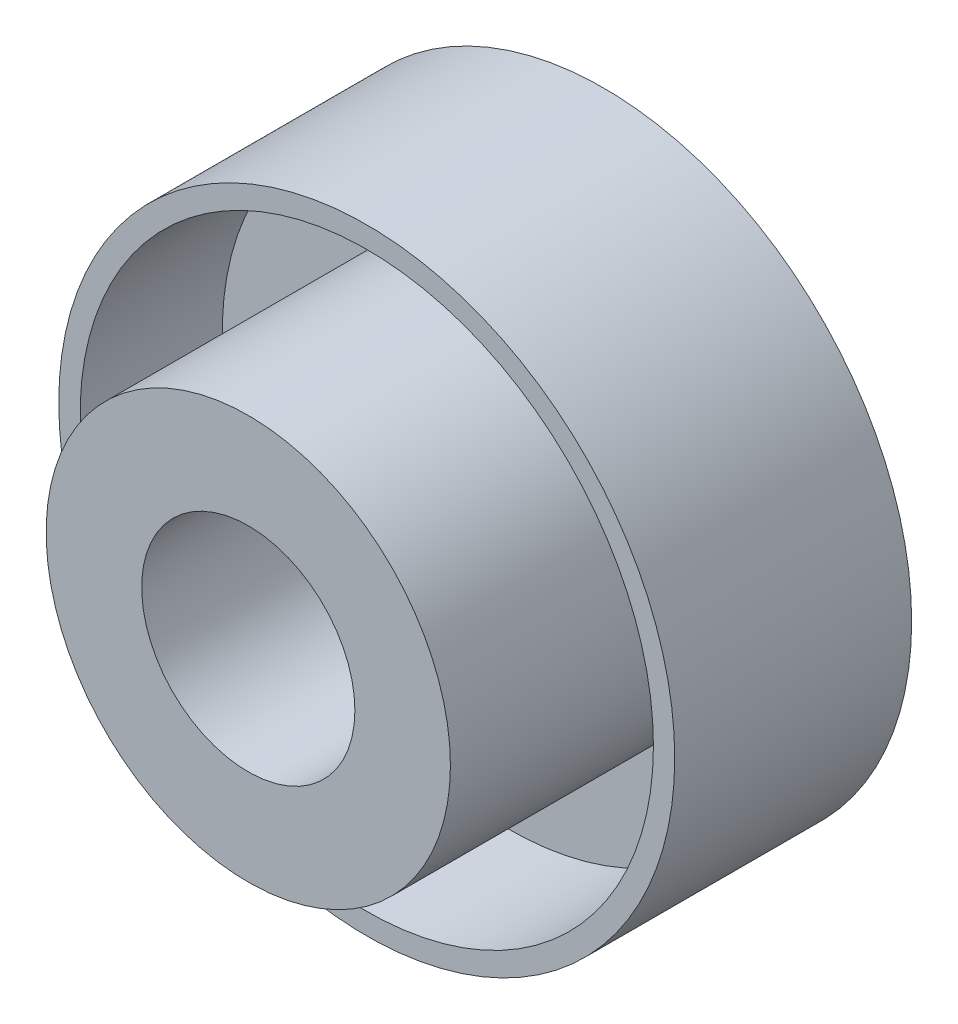
ISO-10303-21;
HEADER;
FILE_DESCRIPTION(('STEP AP214'),'2;1');
FILE_NAME('part.step','',(''),(''),'','','');
FILE_SCHEMA(('AUTOMOTIVE_DESIGN { 1 0 10303 214 1 1 1 1 }'));
ENDSEC;
DATA;
#1=APPLICATION_CONTEXT('core data for automotive mechanical design processes');
#2=APPLICATION_PROTOCOL_DEFINITION('international standard','automotive_design',2000,#1);
#3=PRODUCT_CONTEXT('',#1,'mechanical');
#4=PRODUCT('Part','Part','',(#3));
#5=PRODUCT_RELATED_PRODUCT_CATEGORY('part','',(#4));
#6=PRODUCT_DEFINITION_FORMATION('','',#4);
#7=PRODUCT_DEFINITION_CONTEXT('part definition',#1,'design');
#8=PRODUCT_DEFINITION('design','',#6,#7);
#9=PRODUCT_DEFINITION_SHAPE('','',#8);
#10=(LENGTH_UNIT() NAMED_UNIT(*) SI_UNIT(.MILLI.,.METRE.));
#11=(NAMED_UNIT(*) PLANE_ANGLE_UNIT() SI_UNIT($,.RADIAN.));
#12=(NAMED_UNIT(*) SI_UNIT($,.STERADIAN.) SOLID_ANGLE_UNIT());
#13=UNCERTAINTY_MEASURE_WITH_UNIT(LENGTH_MEASURE(1.E-05),#10,'distance_accuracy_value','');
#14=(GEOMETRIC_REPRESENTATION_CONTEXT(3) GLOBAL_UNCERTAINTY_ASSIGNED_CONTEXT((#13)) GLOBAL_UNIT_ASSIGNED_CONTEXT((#10,
#11,#12)) REPRESENTATION_CONTEXT('',''));
#15=CARTESIAN_POINT('',(0.,0.,0.));
#16=DIRECTION('',(0.,0.,1.));
#17=DIRECTION('',(1.,0.,0.));
#18=AXIS2_PLACEMENT_3D('',#15,#16,#17);
#19=CARTESIAN_POINT('',(0.,0.,4.));
#20=DIRECTION('',(0.,0.,1.));
#21=DIRECTION('',(1.,0.,0.));
#22=AXIS2_PLACEMENT_3D('',#19,#20,#21);
#23=PLANE('',#22);
#24=CARTESIAN_POINT('',(0.,0.,4.));
#25=DIRECTION('',(0.,0.,1.));
#26=DIRECTION('',(1.,0.,0.));
#27=AXIS2_PLACEMENT_3D('',#24,#25,#26);
#28=CIRCLE('',#27,8.53183772377264);
#29=CARTESIAN_POINT('',(8.53183772377264,0.,4.));
#30=VERTEX_POINT('',#29);
#31=EDGE_CURVE('E10',#30,#30,#28,.T.);
#32=ORIENTED_EDGE('',*,*,#31,.F.);
#33=EDGE_LOOP('',(#32));
#34=FACE_BOUND('',#33,.T.);
#35=CARTESIAN_POINT('',(0.,0.,4.));
#36=DIRECTION('',(0.,0.,1.));
#37=DIRECTION('',(1.,0.,0.));
#38=AXIS2_PLACEMENT_3D('',#35,#36,#37);
#39=CIRCLE('',#38,12.1);
#40=CARTESIAN_POINT('',(12.1,0.,4.));
#41=VERTEX_POINT('',#40);
#42=EDGE_CURVE('E38',#41,#41,#39,.F.);
#43=ORIENTED_EDGE('',*,*,#42,.F.);
#44=EDGE_LOOP('',(#43));
#45=FACE_BOUND('',#44,.T.);
#46=ADVANCED_FACE('F31',(#34,#45),#23,.T.);
#47=CARTESIAN_POINT('',(0.,0.,0.));
#48=DIRECTION('',(0.,0.,1.));
#49=DIRECTION('',(1.,0.,0.));
#50=AXIS2_PLACEMENT_3D('',#47,#48,#49);
#51=PLANE('',#50);
#52=CARTESIAN_POINT('',(0.,0.,0.));
#53=DIRECTION('',(0.,0.,1.));
#54=DIRECTION('',(1.,0.,0.));
#55=AXIS2_PLACEMENT_3D('',#52,#53,#54);
#56=CIRCLE('',#55,13.);
#57=CARTESIAN_POINT('',(13.,0.,0.));
#58=VERTEX_POINT('',#57);
#59=EDGE_CURVE('E49',#58,#58,#56,.T.);
#60=ORIENTED_EDGE('',*,*,#59,.F.);
#61=EDGE_LOOP('',(#60));
#62=FACE_BOUND('',#61,.T.);
#63=CARTESIAN_POINT('',(0.,0.,0.));
#64=DIRECTION('',(0.,0.,1.));
#65=DIRECTION('',(1.,0.,0.));
#66=AXIS2_PLACEMENT_3D('',#63,#64,#65);
#67=CIRCLE('',#66,4.5);
#68=CARTESIAN_POINT('',(4.5,0.,0.));
#69=VERTEX_POINT('',#68);
#70=EDGE_CURVE('E55',#69,#69,#67,.T.);
#71=ORIENTED_EDGE('',*,*,#70,.T.);
#72=EDGE_LOOP('',(#71));
#73=FACE_BOUND('',#72,.T.);
#74=ADVANCED_FACE('F33',(#62,#73),#51,.F.);
#75=CARTESIAN_POINT('',(0.,0.,10.));
#76=DIRECTION('',(0.,0.,-1.));
#77=DIRECTION('',(-1.,0.,0.));
#78=AXIS2_PLACEMENT_3D('',#75,#76,#77);
#79=CYLINDRICAL_SURFACE('',#78,12.1);
#80=ORIENTED_EDGE('',*,*,#42,.T.);
#81=EDGE_LOOP('',(#80));
#82=FACE_BOUND('',#81,.T.);
#83=CARTESIAN_POINT('',(0.,0.,10.));
#84=DIRECTION('',(0.,0.,1.));
#85=DIRECTION('',(1.,0.,0.));
#86=AXIS2_PLACEMENT_3D('',#83,#84,#85);
#87=CIRCLE('',#86,12.1);
#88=CARTESIAN_POINT('',(12.1,0.,10.));
#89=VERTEX_POINT('',#88);
#90=EDGE_CURVE('E46',#89,#89,#87,.T.);
#91=ORIENTED_EDGE('',*,*,#90,.T.);
#92=EDGE_LOOP('',(#91));
#93=FACE_BOUND('',#92,.T.);
#94=ADVANCED_FACE('F86',(#82,#93),#79,.F.);
#95=CARTESIAN_POINT('',(0.,0.,10.));
#96=DIRECTION('',(0.,0.,-1.));
#97=DIRECTION('',(-1.,0.,0.));
#98=AXIS2_PLACEMENT_3D('',#95,#96,#97);
#99=CYLINDRICAL_SURFACE('',#98,13.);
#100=CARTESIAN_POINT('',(0.,0.,10.));
#101=DIRECTION('',(0.,0.,1.));
#102=DIRECTION('',(1.,0.,0.));
#103=AXIS2_PLACEMENT_3D('',#100,#101,#102);
#104=CIRCLE('',#103,13.);
#105=CARTESIAN_POINT('',(13.,0.,10.));
#106=VERTEX_POINT('',#105);
#107=EDGE_CURVE('E42',#106,#106,#104,.T.);
#108=ORIENTED_EDGE('',*,*,#107,.F.);
#109=EDGE_LOOP('',(#108));
#110=FACE_BOUND('',#109,.T.);
#111=ORIENTED_EDGE('',*,*,#59,.T.);
#112=EDGE_LOOP('',(#111));
#113=FACE_BOUND('',#112,.T.);
#114=ADVANCED_FACE('F92',(#110,#113),#99,.T.);
#115=CARTESIAN_POINT('',(0.,0.,10.));
#116=DIRECTION('',(0.,0.,1.));
#117=DIRECTION('',(1.,0.,0.));
#118=AXIS2_PLACEMENT_3D('',#115,#116,#117);
#119=PLANE('',#118);
#120=ORIENTED_EDGE('',*,*,#90,.F.);
#121=EDGE_LOOP('',(#120));
#122=FACE_BOUND('',#121,.T.);
#123=ORIENTED_EDGE('',*,*,#107,.T.);
#124=EDGE_LOOP('',(#123));
#125=FACE_BOUND('',#124,.T.);
#126=ADVANCED_FACE('F79',(#122,#125),#119,.T.);
#127=CARTESIAN_POINT('',(0.,0.,15.));
#128=DIRECTION('',(0.,0.,-1.));
#129=DIRECTION('',(-1.,0.,0.));
#130=AXIS2_PLACEMENT_3D('',#127,#128,#129);
#131=CYLINDRICAL_SURFACE('',#130,4.5);
#132=CARTESIAN_POINT('',(0.,0.,15.));
#133=DIRECTION('',(0.,0.,1.));
#134=DIRECTION('',(1.,0.,0.));
#135=AXIS2_PLACEMENT_3D('',#132,#133,#134);
#136=CIRCLE('',#135,4.5);
#137=CARTESIAN_POINT('',(4.5,0.,15.));
#138=VERTEX_POINT('',#137);
#139=EDGE_CURVE('E58',#138,#138,#136,.T.);
#140=ORIENTED_EDGE('',*,*,#139,.T.);
#141=EDGE_LOOP('',(#140));
#142=FACE_BOUND('',#141,.T.);
#143=ORIENTED_EDGE('',*,*,#70,.F.);
#144=EDGE_LOOP('',(#143));
#145=FACE_BOUND('',#144,.T.);
#146=ADVANCED_FACE('F64',(#142,#145),#131,.F.);
#147=CARTESIAN_POINT('',(0.,0.,15.));
#148=DIRECTION('',(0.,0.,-1.));
#149=DIRECTION('',(-1.,0.,0.));
#150=AXIS2_PLACEMENT_3D('',#147,#148,#149);
#151=CYLINDRICAL_SURFACE('',#150,8.53183772377264);
#152=ORIENTED_EDGE('',*,*,#31,.T.);
#153=EDGE_LOOP('',(#152));
#154=FACE_BOUND('',#153,.T.);
#155=CARTESIAN_POINT('',(0.,0.,15.));
#156=DIRECTION('',(0.,0.,1.));
#157=DIRECTION('',(1.,0.,0.));
#158=AXIS2_PLACEMENT_3D('',#155,#156,#157);
#159=CIRCLE('',#158,8.53183772377264);
#160=CARTESIAN_POINT('',(8.53183772377264,0.,15.));
#161=VERTEX_POINT('',#160);
#162=EDGE_CURVE('E51',#161,#161,#159,.T.);
#163=ORIENTED_EDGE('',*,*,#162,.F.);
#164=EDGE_LOOP('',(#163));
#165=FACE_BOUND('',#164,.T.);
#166=ADVANCED_FACE('F70',(#154,#165),#151,.T.);
#167=CARTESIAN_POINT('',(0.,0.,15.));
#168=DIRECTION('',(0.,0.,1.));
#169=DIRECTION('',(1.,0.,0.));
#170=AXIS2_PLACEMENT_3D('',#167,#168,#169);
#171=PLANE('',#170);
#172=ORIENTED_EDGE('',*,*,#139,.F.);
#173=EDGE_LOOP('',(#172));
#174=FACE_BOUND('',#173,.T.);
#175=ORIENTED_EDGE('',*,*,#162,.T.);
#176=EDGE_LOOP('',(#175));
#177=FACE_BOUND('',#176,.T.);
#178=ADVANCED_FACE('F67',(#174,#177),#171,.T.);
#179=CLOSED_SHELL('',(#46,#74,#94,#114,#126,#146,#166,#178));
#180=MANIFOLD_SOLID_BREP('B2',#179);
#181=ADVANCED_BREP_SHAPE_REPRESENTATION('',(#18,#180),#14);
#182=SHAPE_DEFINITION_REPRESENTATION(#9,#181);
ENDSEC;
END-ISO-10303-21;
